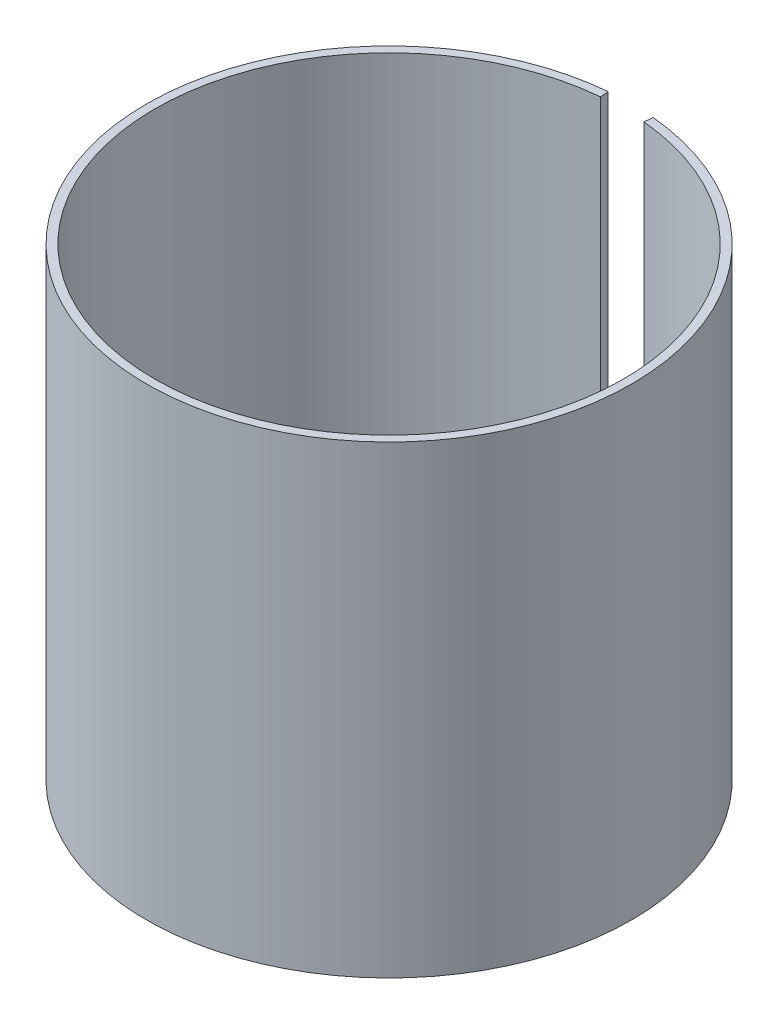
ISO-10303-21;
HEADER;
FILE_DESCRIPTION(('STEP AP214'),'2;1');
FILE_NAME('part.step','',(''),(''),'','','');
FILE_SCHEMA(('AUTOMOTIVE_DESIGN { 1 0 10303 214 1 1 1 1 }'));
ENDSEC;
DATA;
#1=APPLICATION_CONTEXT('core data for automotive mechanical design processes');
#2=APPLICATION_PROTOCOL_DEFINITION('international standard','automotive_design',2000,#1);
#3=PRODUCT_CONTEXT('',#1,'mechanical');
#4=PRODUCT('Part','Part','',(#3));
#5=PRODUCT_RELATED_PRODUCT_CATEGORY('part','',(#4));
#6=PRODUCT_DEFINITION_FORMATION('','',#4);
#7=PRODUCT_DEFINITION_CONTEXT('part definition',#1,'design');
#8=PRODUCT_DEFINITION('design','',#6,#7);
#9=PRODUCT_DEFINITION_SHAPE('','',#8);
#10=(LENGTH_UNIT() NAMED_UNIT(*) SI_UNIT(.MILLI.,.METRE.));
#11=(NAMED_UNIT(*) PLANE_ANGLE_UNIT() SI_UNIT($,.RADIAN.));
#12=(NAMED_UNIT(*) SI_UNIT($,.STERADIAN.) SOLID_ANGLE_UNIT());
#13=UNCERTAINTY_MEASURE_WITH_UNIT(LENGTH_MEASURE(1.E-05),#10,'distance_accuracy_value','');
#14=(GEOMETRIC_REPRESENTATION_CONTEXT(3) GLOBAL_UNCERTAINTY_ASSIGNED_CONTEXT((#13)) GLOBAL_UNIT_ASSIGNED_CONTEXT((#10,
#11,#12)) REPRESENTATION_CONTEXT('',''));
#15=CARTESIAN_POINT('',(0.,0.,0.));
#16=DIRECTION('',(0.,0.,1.));
#17=DIRECTION('',(1.,0.,0.));
#18=AXIS2_PLACEMENT_3D('',#15,#16,#17);
#19=CARTESIAN_POINT('',(0.,165.5,0.));
#20=DIRECTION('',(0.,1.,0.));
#21=DIRECTION('',(0.,0.,1.));
#22=AXIS2_PLACEMENT_3D('',#19,#20,#21);
#23=PLANE('',#22);
#24=DIRECTION('',(0.0924855491329479,0.,0.995714026817729));
#25=VECTOR('',#24,1.);
#26=CARTESIAN_POINT('',(-8.,165.5,-86.1292633197335));
#27=LINE('',#26,#25);
#28=CARTESIAN_POINT('',(-8.,165.5,-86.1292633197336));
#29=VERTEX_POINT('',#28);
#30=CARTESIAN_POINT('',(-7.72254335260116,165.5,-83.1421212392804));
#31=VERTEX_POINT('',#30);
#32=EDGE_CURVE('E47',#29,#31,#27,.T.);
#33=ORIENTED_EDGE('',*,*,#32,.F.);
#34=CARTESIAN_POINT('',(0.,165.5,0.));
#35=DIRECTION('',(0.,1.,0.));
#36=DIRECTION('',(0.,0.,1.));
#37=AXIS2_PLACEMENT_3D('',#34,#35,#36);
#38=CIRCLE('',#37,86.5);
#39=CARTESIAN_POINT('',(8.00000000000001,165.5,-86.1292633197336));
#40=VERTEX_POINT('',#39);
#41=EDGE_CURVE('E11',#29,#40,#38,.T.);
#42=ORIENTED_EDGE('',*,*,#41,.T.);
#43=DIRECTION('',(0.0924855491329479,0.,-0.995714026817729));
#44=VECTOR('',#43,1.);
#45=CARTESIAN_POINT('',(7.72254335260116,165.5,-83.1421212392804));
#46=LINE('',#45,#44);
#47=CARTESIAN_POINT('',(7.72254335260116,165.5,-83.1421212392804));
#48=VERTEX_POINT('',#47);
#49=EDGE_CURVE('E98',#48,#40,#46,.T.);
#50=ORIENTED_EDGE('',*,*,#49,.F.);
#51=CARTESIAN_POINT('',(0.,165.5,0.));
#52=DIRECTION('',(0.,1.,0.));
#53=DIRECTION('',(0.,0.,1.));
#54=AXIS2_PLACEMENT_3D('',#51,#52,#53);
#55=CIRCLE('',#54,83.5);
#56=EDGE_CURVE('E96',#31,#48,#55,.T.);
#57=ORIENTED_EDGE('',*,*,#56,.F.);
#58=EDGE_LOOP('',(#33,#42,#50,#57));
#59=FACE_BOUND('',#58,.T.);
#60=ADVANCED_FACE('F43',(#59),#23,.T.);
#61=CARTESIAN_POINT('',(0.,0.,0.));
#62=DIRECTION('',(0.,1.,0.));
#63=DIRECTION('',(0.,0.,1.));
#64=AXIS2_PLACEMENT_3D('',#61,#62,#63);
#65=PLANE('',#64);
#66=CARTESIAN_POINT('',(0.,0.,0.));
#67=DIRECTION('',(0.,1.,0.));
#68=DIRECTION('',(0.,0.,1.));
#69=AXIS2_PLACEMENT_3D('',#66,#67,#68);
#70=CIRCLE('',#69,86.5);
#71=CARTESIAN_POINT('',(-8.,0.,-86.1292633197335));
#72=VERTEX_POINT('',#71);
#73=CARTESIAN_POINT('',(8.00000000000003,0.,-86.1292633197335));
#74=VERTEX_POINT('',#73);
#75=EDGE_CURVE('E53',#72,#74,#70,.T.);
#76=ORIENTED_EDGE('',*,*,#75,.F.);
#77=DIRECTION('',(0.0924855491329479,0.,0.995714026817729));
#78=VECTOR('',#77,1.);
#79=CARTESIAN_POINT('',(-8.,0.,-86.1292633197335));
#80=LINE('',#79,#78);
#81=CARTESIAN_POINT('',(-7.72254335260116,0.,-83.1421212392804));
#82=VERTEX_POINT('',#81);
#83=EDGE_CURVE('E84',#72,#82,#80,.T.);
#84=ORIENTED_EDGE('',*,*,#83,.T.);
#85=CARTESIAN_POINT('',(0.,0.,0.));
#86=DIRECTION('',(0.,1.,0.));
#87=DIRECTION('',(0.,0.,1.));
#88=AXIS2_PLACEMENT_3D('',#85,#86,#87);
#89=CIRCLE('',#88,83.5);
#90=CARTESIAN_POINT('',(7.72254335260116,0.,-83.1421212392804));
#91=VERTEX_POINT('',#90);
#92=EDGE_CURVE('E97',#82,#91,#89,.T.);
#93=ORIENTED_EDGE('',*,*,#92,.T.);
#94=DIRECTION('',(0.0924855491329479,0.,-0.995714026817729));
#95=VECTOR('',#94,1.);
#96=CARTESIAN_POINT('',(7.72254335260116,0.,-83.1421212392804));
#97=LINE('',#96,#95);
#98=EDGE_CURVE('E61',#91,#74,#97,.T.);
#99=ORIENTED_EDGE('',*,*,#98,.T.);
#100=EDGE_LOOP('',(#76,#84,#93,#99));
#101=FACE_BOUND('',#100,.T.);
#102=ADVANCED_FACE('F114',(#101),#65,.F.);
#103=CARTESIAN_POINT('',(0.,165.5,0.));
#104=DIRECTION('',(0.,-1.,0.));
#105=DIRECTION('',(0.,0.,-1.));
#106=AXIS2_PLACEMENT_3D('',#103,#104,#105);
#107=CYLINDRICAL_SURFACE('',#106,86.5);
#108=ORIENTED_EDGE('',*,*,#41,.F.);
#109=DIRECTION('',(0.,1.,0.));
#110=VECTOR('',#109,1.);
#111=CARTESIAN_POINT('',(-8.,0.,-86.1292633197335));
#112=LINE('',#111,#110);
#113=EDGE_CURVE('E77',#72,#29,#112,.T.);
#114=ORIENTED_EDGE('',*,*,#113,.F.);
#115=ORIENTED_EDGE('',*,*,#75,.T.);
#116=DIRECTION('',(0.,1.,0.));
#117=VECTOR('',#116,1.);
#118=CARTESIAN_POINT('',(8.00000000000003,0.,-86.1292633197335));
#119=LINE('',#118,#117);
#120=EDGE_CURVE('E90',#74,#40,#119,.T.);
#121=ORIENTED_EDGE('',*,*,#120,.T.);
#122=EDGE_LOOP('',(#108,#114,#115,#121));
#123=FACE_BOUND('',#122,.T.);
#124=ADVANCED_FACE('F45',(#123),#107,.T.);
#125=CARTESIAN_POINT('',(0.,165.5,0.));
#126=DIRECTION('',(0.,-1.,0.));
#127=DIRECTION('',(0.,0.,-1.));
#128=AXIS2_PLACEMENT_3D('',#125,#126,#127);
#129=CYLINDRICAL_SURFACE('',#128,83.5);
#130=DIRECTION('',(0.,1.,0.));
#131=VECTOR('',#130,1.);
#132=CARTESIAN_POINT('',(-7.72254335260116,0.,-83.1421212392804));
#133=LINE('',#132,#131);
#134=EDGE_CURVE('E89',#82,#31,#133,.T.);
#135=ORIENTED_EDGE('',*,*,#134,.T.);
#136=ORIENTED_EDGE('',*,*,#56,.T.);
#137=DIRECTION('',(0.,1.,0.));
#138=VECTOR('',#137,1.);
#139=CARTESIAN_POINT('',(7.72254335260116,0.,-83.1421212392804));
#140=LINE('',#139,#138);
#141=EDGE_CURVE('E101',#91,#48,#140,.T.);
#142=ORIENTED_EDGE('',*,*,#141,.F.);
#143=ORIENTED_EDGE('',*,*,#92,.F.);
#144=EDGE_LOOP('',(#135,#136,#142,#143));
#145=FACE_BOUND('',#144,.T.);
#146=ADVANCED_FACE('F116',(#145),#129,.F.);
#147=CARTESIAN_POINT('',(7.72254335260116,0.,-83.1421212392804));
#148=DIRECTION('',(0.995714026817729,0.,0.0924855491329479));
#149=DIRECTION('',(0.0924855491329479,0.,-0.995714026817729));
#150=AXIS2_PLACEMENT_3D('',#147,#148,#149);
#151=PLANE('',#150);
#152=ORIENTED_EDGE('',*,*,#49,.T.);
#153=ORIENTED_EDGE('',*,*,#120,.F.);
#154=ORIENTED_EDGE('',*,*,#98,.F.);
#155=ORIENTED_EDGE('',*,*,#141,.T.);
#156=EDGE_LOOP('',(#152,#153,#154,#155));
#157=FACE_BOUND('',#156,.T.);
#158=ADVANCED_FACE('F117',(#157),#151,.F.);
#159=CARTESIAN_POINT('',(-8.,0.,-86.1292633197335));
#160=DIRECTION('',(-0.995714026817729,0.,0.0924855491329479));
#161=DIRECTION('',(0.0924855491329479,0.,0.995714026817729));
#162=AXIS2_PLACEMENT_3D('',#159,#160,#161);
#163=PLANE('',#162);
#164=ORIENTED_EDGE('',*,*,#32,.T.);
#165=ORIENTED_EDGE('',*,*,#134,.F.);
#166=ORIENTED_EDGE('',*,*,#83,.F.);
#167=ORIENTED_EDGE('',*,*,#113,.T.);
#168=EDGE_LOOP('',(#164,#165,#166,#167));
#169=FACE_BOUND('',#168,.T.);
#170=ADVANCED_FACE('F79',(#169),#163,.F.);
#171=CLOSED_SHELL('',(#60,#102,#124,#146,#158,#170));
#172=MANIFOLD_SOLID_BREP('B2',#171);
#173=ADVANCED_BREP_SHAPE_REPRESENTATION('',(#18,#172),#14);
#174=SHAPE_DEFINITION_REPRESENTATION(#9,#173);
ENDSEC;
END-ISO-10303-21;
